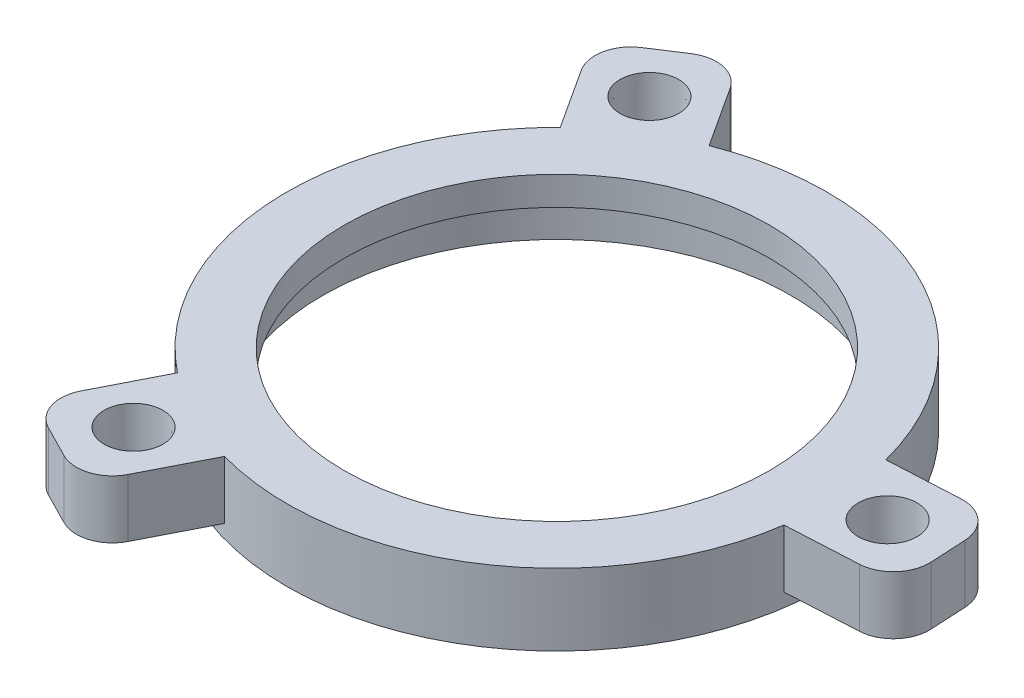
ISO-10303-21;
HEADER;
FILE_DESCRIPTION(('STEP AP214'),'2;1');
FILE_NAME('part.step','',(''),(''),'','','');
FILE_SCHEMA(('AUTOMOTIVE_DESIGN { 1 0 10303 214 1 1 1 1 }'));
ENDSEC;
DATA;
#1=APPLICATION_CONTEXT('core data for automotive mechanical design processes');
#2=APPLICATION_PROTOCOL_DEFINITION('international standard','automotive_design',2000,#1);
#3=PRODUCT_CONTEXT('',#1,'mechanical');
#4=PRODUCT('Part','Part','',(#3));
#5=PRODUCT_RELATED_PRODUCT_CATEGORY('part','',(#4));
#6=PRODUCT_DEFINITION_FORMATION('','',#4);
#7=PRODUCT_DEFINITION_CONTEXT('part definition',#1,'design');
#8=PRODUCT_DEFINITION('design','',#6,#7);
#9=PRODUCT_DEFINITION_SHAPE('','',#8);
#10=(LENGTH_UNIT() NAMED_UNIT(*) SI_UNIT(.MILLI.,.METRE.));
#11=(NAMED_UNIT(*) PLANE_ANGLE_UNIT() SI_UNIT($,.RADIAN.));
#12=(NAMED_UNIT(*) SI_UNIT($,.STERADIAN.) SOLID_ANGLE_UNIT());
#13=UNCERTAINTY_MEASURE_WITH_UNIT(LENGTH_MEASURE(1.E-05),#10,'distance_accuracy_value','');
#14=(GEOMETRIC_REPRESENTATION_CONTEXT(3) GLOBAL_UNCERTAINTY_ASSIGNED_CONTEXT((#13)) GLOBAL_UNIT_ASSIGNED_CONTEXT((#10,
#11,#12)) REPRESENTATION_CONTEXT('',''));
#15=CARTESIAN_POINT('',(0.,0.,0.));
#16=DIRECTION('',(0.,0.,1.));
#17=DIRECTION('',(1.,0.,0.));
#18=AXIS2_PLACEMENT_3D('',#15,#16,#17);
#19=CARTESIAN_POINT('',(0.,10.,0.));
#20=DIRECTION('',(0.,-1.,0.));
#21=DIRECTION('',(0.,0.,-1.));
#22=AXIS2_PLACEMENT_3D('',#19,#20,#21);
#23=PLANE('',#22);
#24=CARTESIAN_POINT('',(-19.9231223774668,10.,39.1013292804801));
#25=DIRECTION('',(0.,1.,0.));
#26=DIRECTION('',(-0.866025403784436,0.,-0.500000000000004));
#27=AXIS2_PLACEMENT_3D('',#24,#25,#26);
#28=CIRCLE('',#27,4.1);
#29=CARTESIAN_POINT('',(-23.473826532983,10.,37.0513292804801));
#30=VERTEX_POINT('',#29);
#31=EDGE_CURVE('E330',#30,#30,#28,.T.);
#32=ORIENTED_EDGE('',*,*,#31,.F.);
#33=EDGE_LOOP('',(#32));
#34=FACE_BOUND('',#33,.T.);
#35=CARTESIAN_POINT('',(-23.9011832899025,10.,-36.8045947418326));
#36=DIRECTION('',(0.,1.,0.));
#37=DIRECTION('',(0.866025403784443,0.,-0.499999999999992));
#38=AXIS2_PLACEMENT_3D('',#35,#36,#37);
#39=CIRCLE('',#38,4.1);
#40=CARTESIAN_POINT('',(-20.3504791343863,10.,-38.8545947418326));
#41=VERTEX_POINT('',#40);
#42=EDGE_CURVE('E196',#41,#41,#39,.T.);
#43=ORIENTED_EDGE('',*,*,#42,.F.);
#44=EDGE_LOOP('',(#43));
#45=FACE_BOUND('',#44,.T.);
#46=CARTESIAN_POINT('',(43.8243056673695,10.,-2.29673453864775));
#47=DIRECTION('',(0.,1.,0.));
#48=DIRECTION('',(0.,0.,1.));
#49=AXIS2_PLACEMENT_3D('',#46,#47,#48);
#50=CIRCLE('',#49,4.1);
#51=CARTESIAN_POINT('',(43.8243056673695,10.,1.80326546135225));
#52=VERTEX_POINT('',#51);
#53=EDGE_CURVE('E228',#52,#52,#50,.T.);
#54=ORIENTED_EDGE('',*,*,#53,.F.);
#55=EDGE_LOOP('',(#54));
#56=FACE_BOUND('',#55,.T.);
#57=DIRECTION('',(-0.544639035015014,0.,-0.838670567945433));
#58=VECTOR('',#57,1.);
#59=CARTESIAN_POINT('',(-13.8046602508068,10.,-35.0279010984072));
#60=LINE('',#59,#58);
#61=CARTESIAN_POINT('',(-13.8046602508068,10.,-35.0279010984072));
#62=VERTEX_POINT('',#61);
#63=CARTESIAN_POINT('',(-19.2510506009569,10.,-43.4146067778615));
#64=VERTEX_POINT('',#63);
#65=EDGE_CURVE('E172',#62,#64,#60,.T.);
#66=ORIENTED_EDGE('',*,*,#65,.T.);
#67=CARTESIAN_POINT('',(-23.4444034406841,10.,-40.6914116027864));
#68=DIRECTION('',(0.,-1.,0.));
#69=DIRECTION('',(0.,0.,-1.));
#70=AXIS2_PLACEMENT_3D('',#67,#68,#69);
#71=CIRCLE('',#70,5.);
#72=CARTESIAN_POINT('',(-26.1675986157591,10.,-44.8847644425136));
#73=VERTEX_POINT('',#72);
#74=EDGE_CURVE('E320',#64,#73,#71,.F.);
#75=ORIENTED_EDGE('',*,*,#74,.T.);
#76=DIRECTION('',(-0.838670567945432,0.,0.544639035015015));
#77=VECTOR('',#76,1.);
#78=CARTESIAN_POINT('',(-34.5543042952134,10.,-39.4383740923635));
#79=LINE('',#78,#77);
#80=CARTESIAN_POINT('',(-30.3609514554863,10.,-42.1615692674385));
#81=VERTEX_POINT('',#80);
#82=EDGE_CURVE('E193',#73,#81,#79,.T.);
#83=ORIENTED_EDGE('',*,*,#82,.T.);
#84=CARTESIAN_POINT('',(-27.6377562804112,10.,-37.9682164277114));
#85=DIRECTION('',(0.,-1.,0.));
#86=DIRECTION('',(0.,0.,-1.));
#87=AXIS2_PLACEMENT_3D('',#84,#85,#86);
#88=CIRCLE('',#87,5.);
#89=CARTESIAN_POINT('',(-31.8311091201384,10.,-35.2450212526363));
#90=VERTEX_POINT('',#89);
#91=EDGE_CURVE('E318',#81,#90,#88,.F.);
#92=ORIENTED_EDGE('',*,*,#91,.T.);
#93=DIRECTION('',(0.544639035015014,0.,0.838670567945432));
#94=VECTOR('',#93,1.);
#95=CARTESIAN_POINT('',(-26.3847187699882,10.,-26.858315573182));
#96=LINE('',#95,#94);
#97=CARTESIAN_POINT('',(-26.3847187699882,10.,-26.858315573182));
#98=VERTEX_POINT('',#97);
#99=EDGE_CURVE('E191',#90,#98,#96,.T.);
#100=ORIENTED_EDGE('',*,*,#99,.T.);
#101=CARTESIAN_POINT('',(0.,10.,0.));
#102=DIRECTION('',(0.,1.,0.));
#103=DIRECTION('',(0.,0.,1.));
#104=AXIS2_PLACEMENT_3D('',#101,#102,#103);
#105=CIRCLE('',#104,37.65);
#106=CARTESIAN_POINT('',(-23.4327220670659,10.,29.4691370170156));
#107=VERTEX_POINT('',#106);
#108=EDGE_CURVE('E275',#98,#107,#105,.T.);
#109=ORIENTED_EDGE('',*,*,#108,.T.);
#110=DIRECTION('',(-0.453990499739557,0.,0.891006524188363));
#111=VECTOR('',#110,1.);
#112=CARTESIAN_POINT('',(-23.4327220670659,10.,29.4691370170156));
#113=LINE('',#112,#111);
#114=CARTESIAN_POINT('',(-27.9726270644615,10.,38.3792022588992));
#115=VERTEX_POINT('',#114);
#116=EDGE_CURVE('E204',#107,#115,#113,.T.);
#117=ORIENTED_EDGE('',*,*,#116,.T.);
#118=CARTESIAN_POINT('',(-23.5175944435197,10.,40.649154757597));
#119=DIRECTION('',(0.,-1.,0.));
#120=DIRECTION('',(0.,0.,-1.));
#121=AXIS2_PLACEMENT_3D('',#118,#119,#120);
#122=CIRCLE('',#121,5.);
#123=CARTESIAN_POINT('',(-25.7875469422175,10.,45.1041873785388));
#124=VERTEX_POINT('',#123);
#125=EDGE_CURVE('E303',#115,#124,#122,.F.);
#126=ORIENTED_EDGE('',*,*,#125,.T.);
#127=DIRECTION('',(0.891006524188364,0.,0.453990499739556));
#128=VECTOR('',#127,1.);
#129=CARTESIAN_POINT('',(-16.8774817003339,10.,49.6440923759344));
#130=LINE('',#129,#128);
#131=CARTESIAN_POINT('',(-21.3325143212757,10.,47.3741398772366));
#132=VERTEX_POINT('',#131);
#133=EDGE_CURVE('E221',#124,#132,#130,.T.);
#134=ORIENTED_EDGE('',*,*,#133,.T.);
#135=CARTESIAN_POINT('',(-19.0625618225779,10.,42.9191072562948));
#136=DIRECTION('',(0.,-1.,0.));
#137=DIRECTION('',(0.,0.,-1.));
#138=AXIS2_PLACEMENT_3D('',#135,#136,#137);
#139=CIRCLE('',#138,5.);
#140=CARTESIAN_POINT('',(-14.6075292016361,10.,45.1890597549926));
#141=VERTEX_POINT('',#140);
#142=EDGE_CURVE('E301',#132,#141,#139,.F.);
#143=ORIENTED_EDGE('',*,*,#142,.T.);
#144=DIRECTION('',(0.453990499739557,0.,-0.891006524188363));
#145=VECTOR('',#144,1.);
#146=CARTESIAN_POINT('',(-10.0676242042405,10.,36.278994513109));
#147=LINE('',#146,#145);
#148=CARTESIAN_POINT('',(-10.0676242042405,10.,36.278994513109));
#149=VERTEX_POINT('',#148);
#150=EDGE_CURVE('E210',#141,#149,#147,.T.);
#151=ORIENTED_EDGE('',*,*,#150,.T.);
#152=CARTESIAN_POINT('',(37.2373823178729,10.,5.55876408139134));
#153=VERTEX_POINT('',#152);
#154=EDGE_CURVE('E276',#149,#153,#105,.T.);
#155=ORIENTED_EDGE('',*,*,#154,.T.);
#156=DIRECTION('',(0.998629534754574,0.,-0.0523359562429371));
#157=VECTOR('',#156,1.);
#158=CARTESIAN_POINT('',(37.2373823178729,10.,5.55876408139134));
#159=LINE('',#158,#157);
#160=CARTESIAN_POINT('',(47.2236776654186,10.,5.03540451896196));
#161=VERTEX_POINT('',#160);
#162=EDGE_CURVE('E247',#153,#161,#159,.T.);
#163=ORIENTED_EDGE('',*,*,#162,.T.);
#164=CARTESIAN_POINT('',(46.9619978842039,10.,0.0422568451890935));
#165=DIRECTION('',(0.,-1.,0.));
#166=DIRECTION('',(0.,0.,-1.));
#167=AXIS2_PLACEMENT_3D('',#164,#165,#166);
#168=CIRCLE('',#167,5.);
#169=CARTESIAN_POINT('',(51.9551455579768,10.,-0.219422936025599));
#170=VERTEX_POINT('',#169);
#171=EDGE_CURVE('E283',#161,#170,#168,.F.);
#172=ORIENTED_EDGE('',*,*,#171,.T.);
#173=DIRECTION('',(-0.0523359562429387,0.,-0.998629534754574));
#174=VECTOR('',#173,1.);
#175=CARTESIAN_POINT('',(51.4317859955474,10.,-10.2057182835713));
#176=LINE('',#175,#174);
#177=CARTESIAN_POINT('',(51.6934657767621,10.,-5.21257060979846));
#178=VERTEX_POINT('',#177);
#179=EDGE_CURVE('E250',#170,#178,#176,.T.);
#180=ORIENTED_EDGE('',*,*,#179,.T.);
#181=CARTESIAN_POINT('',(46.7003181029892,10.,-4.95089082858377));
#182=DIRECTION('',(0.,-1.,0.));
#183=DIRECTION('',(0.,0.,-1.));
#184=AXIS2_PLACEMENT_3D('',#181,#182,#183);
#185=CIRCLE('',#184,5.);
#186=CARTESIAN_POINT('',(46.4386383217746,10.,-9.94403850235664));
#187=VERTEX_POINT('',#186);
#188=EDGE_CURVE('E281',#178,#187,#185,.F.);
#189=ORIENTED_EDGE('',*,*,#188,.T.);
#190=DIRECTION('',(-0.998629534754574,0.,0.0523359562429376));
#191=VECTOR('',#190,1.);
#192=CARTESIAN_POINT('',(36.4523429742288,10.,-9.42067893992727));
#193=LINE('',#192,#191);
#194=CARTESIAN_POINT('',(36.4523429742288,10.,-9.42067893992727));
#195=VERTEX_POINT('',#194);
#196=EDGE_CURVE('E238',#187,#195,#193,.T.);
#197=ORIENTED_EDGE('',*,*,#196,.T.);
#198=EDGE_CURVE('E272',#195,#62,#105,.T.);
#199=ORIENTED_EDGE('',*,*,#198,.T.);
#200=EDGE_LOOP('',(#66,#75,#83,#92,#100,#109,#117,#126,#134,#143,#151,#155,#163,#172,#180,#189,
#197,#199));
#201=FACE_BOUND('',#200,.T.);
#202=CARTESIAN_POINT('',(0.,10.,0.));
#203=DIRECTION('',(0.,1.,0.));
#204=DIRECTION('',(0.,0.,1.));
#205=AXIS2_PLACEMENT_3D('',#202,#203,#204);
#206=CIRCLE('',#205,29.65);
#207=CARTESIAN_POINT('',(0.,10.,29.65));
#208=VERTEX_POINT('',#207);
#209=EDGE_CURVE('E257',#208,#208,#206,.T.);
#210=ORIENTED_EDGE('',*,*,#209,.F.);
#211=EDGE_LOOP('',(#210));
#212=FACE_BOUND('',#211,.T.);
#213=ADVANCED_FACE('F38',(#34,#45,#56,#201,#212),#23,.F.);
#214=CARTESIAN_POINT('',(0.,10.,0.));
#215=DIRECTION('',(0.,-1.,0.));
#216=DIRECTION('',(0.,0.,-1.));
#217=AXIS2_PLACEMENT_3D('',#214,#215,#216);
#218=CYLINDRICAL_SURFACE('',#217,32.65);
#219=CARTESIAN_POINT('',(0.,0.,0.));
#220=DIRECTION('',(0.,1.,0.));
#221=DIRECTION('',(0.,0.,1.));
#222=AXIS2_PLACEMENT_3D('',#219,#220,#221);
#223=CIRCLE('',#222,32.65);
#224=CARTESIAN_POINT('',(0.,0.,32.65));
#225=VERTEX_POINT('',#224);
#226=EDGE_CURVE('E268',#225,#225,#223,.T.);
#227=ORIENTED_EDGE('',*,*,#226,.F.);
#228=EDGE_LOOP('',(#227));
#229=FACE_BOUND('',#228,.T.);
#230=CARTESIAN_POINT('',(0.,6.,0.));
#231=DIRECTION('',(0.,1.,0.));
#232=DIRECTION('',(0.,0.,1.));
#233=AXIS2_PLACEMENT_3D('',#230,#231,#232);
#234=CIRCLE('',#233,32.65);
#235=CARTESIAN_POINT('',(0.,6.,32.65));
#236=VERTEX_POINT('',#235);
#237=EDGE_CURVE('E263',#236,#236,#234,.T.);
#238=ORIENTED_EDGE('',*,*,#237,.T.);
#239=EDGE_LOOP('',(#238));
#240=FACE_BOUND('',#239,.T.);
#241=ADVANCED_FACE('F345',(#229,#240),#218,.F.);
#242=CARTESIAN_POINT('',(0.,0.,0.));
#243=DIRECTION('',(0.,1.,0.));
#244=DIRECTION('',(0.,0.,1.));
#245=AXIS2_PLACEMENT_3D('',#242,#243,#244);
#246=PLANE('',#245);
#247=CARTESIAN_POINT('',(0.,0.,0.));
#248=DIRECTION('',(0.,1.,0.));
#249=DIRECTION('',(0.,0.,1.));
#250=AXIS2_PLACEMENT_3D('',#247,#248,#249);
#251=CIRCLE('',#250,37.65);
#252=CARTESIAN_POINT('',(0.,0.,37.65));
#253=VERTEX_POINT('',#252);
#254=EDGE_CURVE('E271',#253,#253,#251,.T.);
#255=ORIENTED_EDGE('',*,*,#254,.F.);
#256=EDGE_LOOP('',(#255));
#257=FACE_BOUND('',#256,.T.);
#258=ORIENTED_EDGE('',*,*,#226,.T.);
#259=EDGE_LOOP('',(#258));
#260=FACE_BOUND('',#259,.T.);
#261=ADVANCED_FACE('F375',(#257,#260),#246,.F.);
#262=CARTESIAN_POINT('',(0.,10.,0.));
#263=DIRECTION('',(0.,-1.,0.));
#264=DIRECTION('',(0.,0.,-1.));
#265=AXIS2_PLACEMENT_3D('',#262,#263,#264);
#266=CYLINDRICAL_SURFACE('',#265,37.65);
#267=ORIENTED_EDGE('',*,*,#108,.F.);
#268=DIRECTION('',(0.,1.,0.));
#269=VECTOR('',#268,1.);
#270=CARTESIAN_POINT('',(-26.3847187699882,1.9,-26.858315573182));
#271=LINE('',#270,#269);
#272=CARTESIAN_POINT('',(-26.3847187699882,1.9,-26.858315573182));
#273=VERTEX_POINT('',#272);
#274=EDGE_CURVE('E177',#273,#98,#271,.T.);
#275=ORIENTED_EDGE('',*,*,#274,.F.);
#276=CARTESIAN_POINT('',(0.,1.9,0.));
#277=DIRECTION('',(0.,-1.,0.));
#278=DIRECTION('',(0.866025403784443,0.,-0.499999999999992));
#279=AXIS2_PLACEMENT_3D('',#276,#277,#278);
#280=CIRCLE('',#279,37.65);
#281=CARTESIAN_POINT('',(-13.8046602508068,1.9,-35.0279010984072));
#282=VERTEX_POINT('',#281);
#283=EDGE_CURVE('E182',#273,#282,#280,.T.);
#284=ORIENTED_EDGE('',*,*,#283,.T.);
#285=DIRECTION('',(0.,1.,0.));
#286=VECTOR('',#285,1.);
#287=CARTESIAN_POINT('',(-13.8046602508068,1.9,-35.0279010984072));
#288=LINE('',#287,#286);
#289=EDGE_CURVE('E165',#282,#62,#288,.T.);
#290=ORIENTED_EDGE('',*,*,#289,.T.);
#291=ORIENTED_EDGE('',*,*,#198,.F.);
#292=DIRECTION('',(0.,1.,0.));
#293=VECTOR('',#292,1.);
#294=CARTESIAN_POINT('',(36.4523429742288,1.9,-9.42067893992727));
#295=LINE('',#294,#293);
#296=CARTESIAN_POINT('',(36.4523429742288,1.9,-9.42067893992727));
#297=VERTEX_POINT('',#296);
#298=EDGE_CURVE('E254',#297,#195,#295,.T.);
#299=ORIENTED_EDGE('',*,*,#298,.F.);
#300=CARTESIAN_POINT('',(0.,1.9,0.));
#301=DIRECTION('',(0.,-1.,0.));
#302=DIRECTION('',(0.,0.,1.));
#303=AXIS2_PLACEMENT_3D('',#300,#301,#302);
#304=CIRCLE('',#303,37.65);
#305=CARTESIAN_POINT('',(37.2373823178729,1.9,5.55876408139134));
#306=VERTEX_POINT('',#305);
#307=EDGE_CURVE('E234',#297,#306,#304,.T.);
#308=ORIENTED_EDGE('',*,*,#307,.T.);
#309=DIRECTION('',(0.,1.,0.));
#310=VECTOR('',#309,1.);
#311=CARTESIAN_POINT('',(37.2373823178729,1.9,5.55876408139134));
#312=LINE('',#311,#310);
#313=EDGE_CURVE('E246',#306,#153,#312,.T.);
#314=ORIENTED_EDGE('',*,*,#313,.T.);
#315=ORIENTED_EDGE('',*,*,#154,.F.);
#316=DIRECTION('',(0.,1.,0.));
#317=VECTOR('',#316,1.);
#318=CARTESIAN_POINT('',(-10.0676242042405,1.9,36.278994513109));
#319=LINE('',#318,#317);
#320=CARTESIAN_POINT('',(-10.0676242042405,1.9,36.278994513109));
#321=VERTEX_POINT('',#320);
#322=EDGE_CURVE('E225',#321,#149,#319,.T.);
#323=ORIENTED_EDGE('',*,*,#322,.F.);
#324=CARTESIAN_POINT('',(0.,1.9,0.));
#325=DIRECTION('',(0.,-1.,0.));
#326=DIRECTION('',(-0.866025403784436,0.,-0.500000000000004));
#327=AXIS2_PLACEMENT_3D('',#324,#325,#326);
#328=CIRCLE('',#327,37.65);
#329=CARTESIAN_POINT('',(-23.4327220670659,1.9,29.4691370170156));
#330=VERTEX_POINT('',#329);
#331=EDGE_CURVE('E206',#321,#330,#328,.T.);
#332=ORIENTED_EDGE('',*,*,#331,.T.);
#333=DIRECTION('',(0.,1.,0.));
#334=VECTOR('',#333,1.);
#335=CARTESIAN_POINT('',(-23.4327220670659,1.9,29.4691370170156));
#336=LINE('',#335,#334);
#337=EDGE_CURVE('E218',#330,#107,#336,.T.);
#338=ORIENTED_EDGE('',*,*,#337,.T.);
#339=EDGE_LOOP('',(#267,#275,#284,#290,#291,#299,#308,#314,#315,#323,#332,#338));
#340=FACE_BOUND('',#339,.T.);
#341=ORIENTED_EDGE('',*,*,#254,.T.);
#342=EDGE_LOOP('',(#341));
#343=FACE_BOUND('',#342,.T.);
#344=ADVANCED_FACE('F188',(#340,#343),#266,.T.);
#345=CARTESIAN_POINT('',(0.,6.,0.));
#346=DIRECTION('',(0.,1.,0.));
#347=DIRECTION('',(0.,0.,1.));
#348=AXIS2_PLACEMENT_3D('',#345,#346,#347);
#349=PLANE('',#348);
#350=CARTESIAN_POINT('',(0.,6.,0.));
#351=DIRECTION('',(0.,1.,0.));
#352=DIRECTION('',(0.,0.,1.));
#353=AXIS2_PLACEMENT_3D('',#350,#351,#352);
#354=CIRCLE('',#353,29.65);
#355=CARTESIAN_POINT('',(0.,6.,29.65));
#356=VERTEX_POINT('',#355);
#357=EDGE_CURVE('E260',#356,#356,#354,.T.);
#358=ORIENTED_EDGE('',*,*,#357,.T.);
#359=EDGE_LOOP('',(#358));
#360=FACE_BOUND('',#359,.T.);
#361=ORIENTED_EDGE('',*,*,#237,.F.);
#362=EDGE_LOOP('',(#361));
#363=FACE_BOUND('',#362,.T.);
#364=ADVANCED_FACE('F356',(#360,#363),#349,.F.);
#365=CARTESIAN_POINT('',(0.,6.,0.));
#366=DIRECTION('',(0.,1.,0.));
#367=DIRECTION('',(0.,0.,1.));
#368=AXIS2_PLACEMENT_3D('',#365,#366,#367);
#369=CYLINDRICAL_SURFACE('',#368,29.65);
#370=ORIENTED_EDGE('',*,*,#357,.F.);
#371=EDGE_LOOP('',(#370));
#372=FACE_BOUND('',#371,.T.);
#373=ORIENTED_EDGE('',*,*,#209,.T.);
#374=EDGE_LOOP('',(#373));
#375=FACE_BOUND('',#374,.T.);
#376=ADVANCED_FACE('F348',(#372,#375),#369,.F.);
#377=CARTESIAN_POINT('',(36.4523429742288,1.9,-9.42067893992727));
#378=DIRECTION('',(-0.0523359562429376,0.,-0.998629534754574));
#379=DIRECTION('',(-0.998629534754574,0.,0.0523359562429376));
#380=AXIS2_PLACEMENT_3D('',#377,#378,#379);
#381=PLANE('',#380);
#382=ORIENTED_EDGE('',*,*,#196,.F.);
#383=DIRECTION('',(0.,1.,0.));
#384=VECTOR('',#383,1.);
#385=CARTESIAN_POINT('',(46.4386383217746,1.9,-9.94403850235664));
#386=LINE('',#385,#384);
#387=CARTESIAN_POINT('',(46.4386383217746,1.9,-9.94403850235664));
#388=VERTEX_POINT('',#387);
#389=EDGE_CURVE('E294',#187,#388,#386,.F.);
#390=ORIENTED_EDGE('',*,*,#389,.T.);
#391=DIRECTION('',(-0.998629534754574,0.,0.0523359562429376));
#392=VECTOR('',#391,1.);
#393=CARTESIAN_POINT('',(36.4523429742288,1.9,-9.42067893992727));
#394=LINE('',#393,#392);
#395=EDGE_CURVE('E244',#388,#297,#394,.T.);
#396=ORIENTED_EDGE('',*,*,#395,.T.);
#397=ORIENTED_EDGE('',*,*,#298,.T.);
#398=EDGE_LOOP('',(#382,#390,#396,#397));
#399=FACE_BOUND('',#398,.T.);
#400=ADVANCED_FACE('F355',(#399),#381,.T.);
#401=CARTESIAN_POINT('',(51.4317859955474,1.9,-10.2057182835713));
#402=DIRECTION('',(0.998629534754574,0.,-0.0523359562429387));
#403=DIRECTION('',(-0.0523359562429387,0.,-0.998629534754574));
#404=AXIS2_PLACEMENT_3D('',#401,#402,#403);
#405=PLANE('',#404);
#406=ORIENTED_EDGE('',*,*,#179,.F.);
#407=DIRECTION('',(0.,1.,0.));
#408=VECTOR('',#407,1.);
#409=CARTESIAN_POINT('',(51.9551455579768,1.9,-0.219422936025598));
#410=LINE('',#409,#408);
#411=CARTESIAN_POINT('',(51.9551455579768,1.9,-0.219422936025599));
#412=VERTEX_POINT('',#411);
#413=EDGE_CURVE('E288',#170,#412,#410,.F.);
#414=ORIENTED_EDGE('',*,*,#413,.T.);
#415=DIRECTION('',(-0.0523359562429387,0.,-0.998629534754574));
#416=VECTOR('',#415,1.);
#417=CARTESIAN_POINT('',(51.4317859955474,1.9,-10.2057182835713));
#418=LINE('',#417,#416);
#419=CARTESIAN_POINT('',(51.6934657767621,1.9,-5.21257060979846));
#420=VERTEX_POINT('',#419);
#421=EDGE_CURVE('E241',#412,#420,#418,.T.);
#422=ORIENTED_EDGE('',*,*,#421,.T.);
#423=DIRECTION('',(0.,1.,0.));
#424=VECTOR('',#423,1.);
#425=CARTESIAN_POINT('',(51.6934657767621,1.9,-5.21257060979846));
#426=LINE('',#425,#424);
#427=EDGE_CURVE('E285',#420,#178,#426,.T.);
#428=ORIENTED_EDGE('',*,*,#427,.T.);
#429=EDGE_LOOP('',(#406,#414,#422,#428));
#430=FACE_BOUND('',#429,.T.);
#431=ADVANCED_FACE('F363',(#430),#405,.T.);
#432=CARTESIAN_POINT('',(37.2373823178729,1.9,5.55876408139134));
#433=DIRECTION('',(0.0523359562429371,0.,0.998629534754574));
#434=DIRECTION('',(0.998629534754574,0.,-0.0523359562429371));
#435=AXIS2_PLACEMENT_3D('',#432,#433,#434);
#436=PLANE('',#435);
#437=DIRECTION('',(0.998629534754574,0.,-0.0523359562429371));
#438=VECTOR('',#437,1.);
#439=CARTESIAN_POINT('',(37.2373823178729,1.9,5.55876408139134));
#440=LINE('',#439,#438);
#441=CARTESIAN_POINT('',(47.2236776654186,1.9,5.03540451896196));
#442=VERTEX_POINT('',#441);
#443=EDGE_CURVE('E237',#306,#442,#440,.T.);
#444=ORIENTED_EDGE('',*,*,#443,.T.);
#445=DIRECTION('',(0.,1.,0.));
#446=VECTOR('',#445,1.);
#447=CARTESIAN_POINT('',(47.2236776654186,1.9,5.03540451896196));
#448=LINE('',#447,#446);
#449=EDGE_CURVE('E274',#442,#161,#448,.T.);
#450=ORIENTED_EDGE('',*,*,#449,.T.);
#451=ORIENTED_EDGE('',*,*,#162,.F.);
#452=ORIENTED_EDGE('',*,*,#313,.F.);
#453=EDGE_LOOP('',(#444,#450,#451,#452));
#454=FACE_BOUND('',#453,.T.);
#455=ADVANCED_FACE('F370',(#454),#436,.T.);
#456=CARTESIAN_POINT('',(0.,1.9,0.));
#457=DIRECTION('',(0.,1.,0.));
#458=DIRECTION('',(0.,0.,1.));
#459=AXIS2_PLACEMENT_3D('',#456,#457,#458);
#460=PLANE('',#459);
#461=CARTESIAN_POINT('',(43.8243056673695,1.9,-2.29673453864775));
#462=DIRECTION('',(0.,1.,0.));
#463=DIRECTION('',(0.,0.,1.));
#464=AXIS2_PLACEMENT_3D('',#461,#462,#463);
#465=CIRCLE('',#464,3.81714176711684);
#466=CARTESIAN_POINT('',(43.8243056673695,1.9,1.52040722846909));
#467=VERTEX_POINT('',#466);
#468=EDGE_CURVE('E233',#467,#467,#465,.T.);
#469=ORIENTED_EDGE('',*,*,#468,.T.);
#470=EDGE_LOOP('',(#469));
#471=FACE_BOUND('',#470,.T.);
#472=ORIENTED_EDGE('',*,*,#421,.F.);
#473=CARTESIAN_POINT('',(46.9619978842039,1.9,0.0422568451890935));
#474=DIRECTION('',(0.,1.,0.));
#475=DIRECTION('',(0.,0.,1.));
#476=AXIS2_PLACEMENT_3D('',#473,#474,#475);
#477=CIRCLE('',#476,5.);
#478=EDGE_CURVE('E292',#412,#442,#477,.F.);
#479=ORIENTED_EDGE('',*,*,#478,.T.);
#480=ORIENTED_EDGE('',*,*,#443,.F.);
#481=ORIENTED_EDGE('',*,*,#307,.F.);
#482=ORIENTED_EDGE('',*,*,#395,.F.);
#483=CARTESIAN_POINT('',(46.7003181029892,1.9,-4.95089082858377));
#484=DIRECTION('',(0.,1.,0.));
#485=DIRECTION('',(0.,0.,1.));
#486=AXIS2_PLACEMENT_3D('',#483,#484,#485);
#487=CIRCLE('',#486,5.);
#488=EDGE_CURVE('E290',#388,#420,#487,.F.);
#489=ORIENTED_EDGE('',*,*,#488,.T.);
#490=EDGE_LOOP('',(#472,#479,#480,#481,#482,#489));
#491=FACE_BOUND('',#490,.T.);
#492=ADVANCED_FACE('F386',(#471,#491),#460,.F.);
#493=CARTESIAN_POINT('',(46.9619978842039,1.9,0.0422568451890935));
#494=DIRECTION('',(0.,1.,0.));
#495=DIRECTION('',(0.,0.,1.));
#496=AXIS2_PLACEMENT_3D('',#493,#494,#495);
#497=CYLINDRICAL_SURFACE('',#496,5.);
#498=ORIENTED_EDGE('',*,*,#478,.F.);
#499=ORIENTED_EDGE('',*,*,#413,.F.);
#500=ORIENTED_EDGE('',*,*,#171,.F.);
#501=ORIENTED_EDGE('',*,*,#449,.F.);
#502=EDGE_LOOP('',(#498,#499,#500,#501));
#503=FACE_BOUND('',#502,.T.);
#504=ADVANCED_FACE('F382',(#503),#497,.T.);
#505=CARTESIAN_POINT('',(46.7003181029892,1.9,-4.95089082858377));
#506=DIRECTION('',(0.,1.,0.));
#507=DIRECTION('',(0.,0.,1.));
#508=AXIS2_PLACEMENT_3D('',#505,#506,#507);
#509=CYLINDRICAL_SURFACE('',#508,5.);
#510=ORIENTED_EDGE('',*,*,#488,.F.);
#511=ORIENTED_EDGE('',*,*,#389,.F.);
#512=ORIENTED_EDGE('',*,*,#188,.F.);
#513=ORIENTED_EDGE('',*,*,#427,.F.);
#514=EDGE_LOOP('',(#510,#511,#512,#513));
#515=FACE_BOUND('',#514,.T.);
#516=ADVANCED_FACE('F385',(#515),#509,.T.);
#517=CARTESIAN_POINT('',(43.8243056673695,10.,-2.29673453864775));
#518=DIRECTION('',(0.,1.,0.));
#519=DIRECTION('',(0.,0.,1.));
#520=AXIS2_PLACEMENT_3D('',#517,#518,#519);
#521=CONICAL_SURFACE('',#520,4.1,0.0349065850398867);
#522=ORIENTED_EDGE('',*,*,#53,.T.);
#523=EDGE_LOOP('',(#522));
#524=FACE_BOUND('',#523,.T.);
#525=ORIENTED_EDGE('',*,*,#468,.F.);
#526=EDGE_LOOP('',(#525));
#527=FACE_BOUND('',#526,.T.);
#528=ADVANCED_FACE('F390',(#524,#527),#521,.F.);
#529=CARTESIAN_POINT('',(-10.0676242042405,1.9,36.278994513109));
#530=DIRECTION('',(0.891006524188363,0.,0.453990499739556));
#531=DIRECTION('',(0.453990499739557,0.,-0.891006524188363));
#532=AXIS2_PLACEMENT_3D('',#529,#530,#531);
#533=PLANE('',#532);
#534=ORIENTED_EDGE('',*,*,#150,.F.);
#535=DIRECTION('',(0.,1.,0.));
#536=VECTOR('',#535,1.);
#537=CARTESIAN_POINT('',(-14.6075292016361,1.9,45.1890597549926));
#538=LINE('',#537,#536);
#539=CARTESIAN_POINT('',(-14.6075292016361,1.9,45.1890597549926));
#540=VERTEX_POINT('',#539);
#541=EDGE_CURVE('E314',#141,#540,#538,.F.);
#542=ORIENTED_EDGE('',*,*,#541,.T.);
#543=DIRECTION('',(0.453990499739557,0.,-0.891006524188363));
#544=VECTOR('',#543,1.);
#545=CARTESIAN_POINT('',(-10.0676242042405,1.9,36.278994513109));
#546=LINE('',#545,#544);
#547=EDGE_CURVE('E216',#540,#321,#546,.T.);
#548=ORIENTED_EDGE('',*,*,#547,.T.);
#549=ORIENTED_EDGE('',*,*,#322,.T.);
#550=EDGE_LOOP('',(#534,#542,#548,#549));
#551=FACE_BOUND('',#550,.T.);
#552=ADVANCED_FACE('F443',(#551),#533,.T.);
#553=CARTESIAN_POINT('',(-16.8774817003339,1.9,49.6440923759344));
#554=DIRECTION('',(-0.453990499739556,0.,0.891006524188363));
#555=DIRECTION('',(0.891006524188364,0.,0.453990499739556));
#556=AXIS2_PLACEMENT_3D('',#553,#554,#555);
#557=PLANE('',#556);
#558=ORIENTED_EDGE('',*,*,#133,.F.);
#559=DIRECTION('',(0.,1.,0.));
#560=VECTOR('',#559,1.);
#561=CARTESIAN_POINT('',(-25.7875469422175,1.9,45.1041873785388));
#562=LINE('',#561,#560);
#563=CARTESIAN_POINT('',(-25.7875469422175,1.9,45.1041873785388));
#564=VERTEX_POINT('',#563);
#565=EDGE_CURVE('E308',#124,#564,#562,.F.);
#566=ORIENTED_EDGE('',*,*,#565,.T.);
#567=DIRECTION('',(0.891006524188364,0.,0.453990499739556));
#568=VECTOR('',#567,1.);
#569=CARTESIAN_POINT('',(-16.8774817003339,1.9,49.6440923759344));
#570=LINE('',#569,#568);
#571=CARTESIAN_POINT('',(-21.3325143212757,1.9,47.3741398772366));
#572=VERTEX_POINT('',#571);
#573=EDGE_CURVE('E213',#564,#572,#570,.T.);
#574=ORIENTED_EDGE('',*,*,#573,.T.);
#575=DIRECTION('',(0.,1.,0.));
#576=VECTOR('',#575,1.);
#577=CARTESIAN_POINT('',(-21.3325143212757,1.9,47.3741398772366));
#578=LINE('',#577,#576);
#579=EDGE_CURVE('E305',#572,#132,#578,.T.);
#580=ORIENTED_EDGE('',*,*,#579,.T.);
#581=EDGE_LOOP('',(#558,#566,#574,#580));
#582=FACE_BOUND('',#581,.T.);
#583=ADVANCED_FACE('F449',(#582),#557,.T.);
#584=CARTESIAN_POINT('',(-23.4327220670659,1.9,29.4691370170156));
#585=DIRECTION('',(-0.891006524188363,0.,-0.453990499739557));
#586=DIRECTION('',(-0.453990499739557,0.,0.891006524188363));
#587=AXIS2_PLACEMENT_3D('',#584,#585,#586);
#588=PLANE('',#587);
#589=DIRECTION('',(-0.453990499739557,0.,0.891006524188363));
#590=VECTOR('',#589,1.);
#591=CARTESIAN_POINT('',(-23.4327220670659,1.9,29.4691370170156));
#592=LINE('',#591,#590);
#593=CARTESIAN_POINT('',(-27.9726270644615,1.9,38.3792022588992));
#594=VERTEX_POINT('',#593);
#595=EDGE_CURVE('E209',#330,#594,#592,.T.);
#596=ORIENTED_EDGE('',*,*,#595,.T.);
#597=DIRECTION('',(0.,1.,0.));
#598=VECTOR('',#597,1.);
#599=CARTESIAN_POINT('',(-27.9726270644615,1.9,38.3792022588992));
#600=LINE('',#599,#598);
#601=EDGE_CURVE('E296',#594,#115,#600,.T.);
#602=ORIENTED_EDGE('',*,*,#601,.T.);
#603=ORIENTED_EDGE('',*,*,#116,.F.);
#604=ORIENTED_EDGE('',*,*,#337,.F.);
#605=EDGE_LOOP('',(#596,#602,#603,#604));
#606=FACE_BOUND('',#605,.T.);
#607=ADVANCED_FACE('F445',(#606),#588,.T.);
#608=CARTESIAN_POINT('',(0.,1.9,0.));
#609=DIRECTION('',(0.,1.,0.));
#610=DIRECTION('',(-0.866025403784436,0.,-0.500000000000004));
#611=AXIS2_PLACEMENT_3D('',#608,#609,#610);
#612=PLANE('',#611);
#613=CARTESIAN_POINT('',(-19.9231223774668,1.9,39.1013292804801));
#614=DIRECTION('',(0.,1.,0.));
#615=DIRECTION('',(0.,0.,1.));
#616=AXIS2_PLACEMENT_3D('',#613,#614,#615);
#617=CIRCLE('',#616,3.81714176711684);
#618=CARTESIAN_POINT('',(-19.9231223774668,1.9,42.9184710475969));
#619=VERTEX_POINT('',#618);
#620=EDGE_CURVE('E42',#619,#619,#617,.T.);
#621=ORIENTED_EDGE('',*,*,#620,.T.);
#622=EDGE_LOOP('',(#621));
#623=FACE_BOUND('',#622,.T.);
#624=ORIENTED_EDGE('',*,*,#573,.F.);
#625=CARTESIAN_POINT('',(-23.5175944435197,1.9,40.649154757597));
#626=DIRECTION('',(0.,1.,0.));
#627=DIRECTION('',(0.,0.,1.));
#628=AXIS2_PLACEMENT_3D('',#625,#626,#627);
#629=CIRCLE('',#628,5.);
#630=EDGE_CURVE('E312',#564,#594,#629,.F.);
#631=ORIENTED_EDGE('',*,*,#630,.T.);
#632=ORIENTED_EDGE('',*,*,#595,.F.);
#633=ORIENTED_EDGE('',*,*,#331,.F.);
#634=ORIENTED_EDGE('',*,*,#547,.F.);
#635=CARTESIAN_POINT('',(-19.0625618225779,1.9,42.9191072562948));
#636=DIRECTION('',(0.,1.,0.));
#637=DIRECTION('',(0.,0.,1.));
#638=AXIS2_PLACEMENT_3D('',#635,#636,#637);
#639=CIRCLE('',#638,5.);
#640=EDGE_CURVE('E310',#540,#572,#639,.F.);
#641=ORIENTED_EDGE('',*,*,#640,.T.);
#642=EDGE_LOOP('',(#624,#631,#632,#633,#634,#641));
#643=FACE_BOUND('',#642,.T.);
#644=ADVANCED_FACE('F448',(#623,#643),#612,.F.);
#645=CARTESIAN_POINT('',(-26.3847187699882,1.9,-26.858315573182));
#646=DIRECTION('',(-0.838670567945432,0.,0.544639035015014));
#647=DIRECTION('',(0.544639035015014,0.,0.838670567945432));
#648=AXIS2_PLACEMENT_3D('',#645,#646,#647);
#649=PLANE('',#648);
#650=ORIENTED_EDGE('',*,*,#99,.F.);
#651=DIRECTION('',(0.,1.,0.));
#652=VECTOR('',#651,1.);
#653=CARTESIAN_POINT('',(-31.8311091201384,1.9,-35.2450212526363));
#654=LINE('',#653,#652);
#655=CARTESIAN_POINT('',(-31.8311091201384,1.9,-35.2450212526363));
#656=VERTEX_POINT('',#655);
#657=EDGE_CURVE('E11',#90,#656,#654,.F.);
#658=ORIENTED_EDGE('',*,*,#657,.T.);
#659=DIRECTION('',(0.544639035015014,0.,0.838670567945432));
#660=VECTOR('',#659,1.);
#661=CARTESIAN_POINT('',(-26.3847187699882,1.9,-26.858315573182));
#662=LINE('',#661,#660);
#663=EDGE_CURVE('E178',#656,#273,#662,.T.);
#664=ORIENTED_EDGE('',*,*,#663,.T.);
#665=ORIENTED_EDGE('',*,*,#274,.T.);
#666=EDGE_LOOP('',(#650,#658,#664,#665));
#667=FACE_BOUND('',#666,.T.);
#668=ADVANCED_FACE('F411',(#667),#649,.T.);
#669=CARTESIAN_POINT('',(-34.5543042952134,1.9,-39.4383740923635));
#670=DIRECTION('',(-0.544639035015015,0.,-0.838670567945432));
#671=DIRECTION('',(-0.838670567945432,0.,0.544639035015015));
#672=AXIS2_PLACEMENT_3D('',#669,#670,#671);
#673=PLANE('',#672);
#674=ORIENTED_EDGE('',*,*,#82,.F.);
#675=DIRECTION('',(0.,1.,0.));
#676=VECTOR('',#675,1.);
#677=CARTESIAN_POINT('',(-26.1675986157591,1.9,-44.8847644425136));
#678=LINE('',#677,#676);
#679=CARTESIAN_POINT('',(-26.1675986157591,1.9,-44.8847644425136));
#680=VERTEX_POINT('',#679);
#681=EDGE_CURVE('E325',#73,#680,#678,.F.);
#682=ORIENTED_EDGE('',*,*,#681,.T.);
#683=DIRECTION('',(-0.838670567945432,0.,0.544639035015015));
#684=VECTOR('',#683,1.);
#685=CARTESIAN_POINT('',(-34.5543042952134,1.9,-39.4383740923635));
#686=LINE('',#685,#684);
#687=CARTESIAN_POINT('',(-30.3609514554863,1.9,-42.1615692674385));
#688=VERTEX_POINT('',#687);
#689=EDGE_CURVE('E185',#680,#688,#686,.T.);
#690=ORIENTED_EDGE('',*,*,#689,.T.);
#691=DIRECTION('',(0.,1.,0.));
#692=VECTOR('',#691,1.);
#693=CARTESIAN_POINT('',(-30.3609514554863,1.9,-42.1615692674385));
#694=LINE('',#693,#692);
#695=EDGE_CURVE('E322',#688,#81,#694,.T.);
#696=ORIENTED_EDGE('',*,*,#695,.T.);
#697=EDGE_LOOP('',(#674,#682,#690,#696));
#698=FACE_BOUND('',#697,.T.);
#699=ADVANCED_FACE('F409',(#698),#673,.T.);
#700=CARTESIAN_POINT('',(-13.8046602508068,1.9,-35.0279010984072));
#701=DIRECTION('',(0.838670567945433,0.,-0.544639035015014));
#702=DIRECTION('',(-0.544639035015014,0.,-0.838670567945433));
#703=AXIS2_PLACEMENT_3D('',#700,#701,#702);
#704=PLANE('',#703);
#705=DIRECTION('',(-0.544639035015014,0.,-0.838670567945433));
#706=VECTOR('',#705,1.);
#707=CARTESIAN_POINT('',(-13.8046602508068,1.9,-35.0279010984072));
#708=LINE('',#707,#706);
#709=CARTESIAN_POINT('',(-19.2510506009569,1.9,-43.4146067778615));
#710=VERTEX_POINT('',#709);
#711=EDGE_CURVE('E169',#282,#710,#708,.T.);
#712=ORIENTED_EDGE('',*,*,#711,.T.);
#713=DIRECTION('',(0.,1.,0.));
#714=VECTOR('',#713,1.);
#715=CARTESIAN_POINT('',(-19.2510506009569,1.9,-43.4146067778615));
#716=LINE('',#715,#714);
#717=EDGE_CURVE('E316',#710,#64,#716,.T.);
#718=ORIENTED_EDGE('',*,*,#717,.T.);
#719=ORIENTED_EDGE('',*,*,#65,.F.);
#720=ORIENTED_EDGE('',*,*,#289,.F.);
#721=EDGE_LOOP('',(#712,#718,#719,#720));
#722=FACE_BOUND('',#721,.T.);
#723=ADVANCED_FACE('F167',(#722),#704,.T.);
#724=CARTESIAN_POINT('',(0.,1.9,0.));
#725=DIRECTION('',(0.,1.,0.));
#726=DIRECTION('',(0.866025403784443,0.,-0.499999999999992));
#727=AXIS2_PLACEMENT_3D('',#724,#725,#726);
#728=PLANE('',#727);
#729=CARTESIAN_POINT('',(-23.9011832899025,1.9,-36.8045947418326));
#730=DIRECTION('',(0.,1.,0.));
#731=DIRECTION('',(0.,0.,1.));
#732=AXIS2_PLACEMENT_3D('',#729,#730,#731);
#733=CIRCLE('',#732,3.81714176711684);
#734=CARTESIAN_POINT('',(-23.9011832899025,1.9,-32.9874529747158));
#735=VERTEX_POINT('',#734);
#736=EDGE_CURVE('E328',#735,#735,#733,.T.);
#737=ORIENTED_EDGE('',*,*,#736,.T.);
#738=EDGE_LOOP('',(#737));
#739=FACE_BOUND('',#738,.T.);
#740=ORIENTED_EDGE('',*,*,#689,.F.);
#741=CARTESIAN_POINT('',(-23.4444034406841,1.9,-40.6914116027864));
#742=DIRECTION('',(0.,1.,0.));
#743=DIRECTION('',(0.,0.,1.));
#744=AXIS2_PLACEMENT_3D('',#741,#742,#743);
#745=CIRCLE('',#744,5.);
#746=EDGE_CURVE('E47',#680,#710,#745,.F.);
#747=ORIENTED_EDGE('',*,*,#746,.T.);
#748=ORIENTED_EDGE('',*,*,#711,.F.);
#749=ORIENTED_EDGE('',*,*,#283,.F.);
#750=ORIENTED_EDGE('',*,*,#663,.F.);
#751=CARTESIAN_POINT('',(-27.6377562804112,1.9,-37.9682164277114));
#752=DIRECTION('',(0.,1.,0.));
#753=DIRECTION('',(0.,0.,1.));
#754=AXIS2_PLACEMENT_3D('',#751,#752,#753);
#755=CIRCLE('',#754,5.);
#756=EDGE_CURVE('E60',#656,#688,#755,.F.);
#757=ORIENTED_EDGE('',*,*,#756,.T.);
#758=EDGE_LOOP('',(#740,#747,#748,#749,#750,#757));
#759=FACE_BOUND('',#758,.T.);
#760=ADVANCED_FACE('F181',(#739,#759),#728,.F.);
#761=CARTESIAN_POINT('',(-23.5175944435197,1.9,40.649154757597));
#762=DIRECTION('',(0.,1.,0.));
#763=DIRECTION('',(0.,0.,1.));
#764=AXIS2_PLACEMENT_3D('',#761,#762,#763);
#765=CYLINDRICAL_SURFACE('',#764,5.);
#766=ORIENTED_EDGE('',*,*,#630,.F.);
#767=ORIENTED_EDGE('',*,*,#565,.F.);
#768=ORIENTED_EDGE('',*,*,#125,.F.);
#769=ORIENTED_EDGE('',*,*,#601,.F.);
#770=EDGE_LOOP('',(#766,#767,#768,#769));
#771=FACE_BOUND('',#770,.T.);
#772=ADVANCED_FACE('F392',(#771),#765,.T.);
#773=CARTESIAN_POINT('',(-19.0625618225779,1.9,42.9191072562948));
#774=DIRECTION('',(0.,1.,0.));
#775=DIRECTION('',(0.,0.,1.));
#776=AXIS2_PLACEMENT_3D('',#773,#774,#775);
#777=CYLINDRICAL_SURFACE('',#776,5.);
#778=ORIENTED_EDGE('',*,*,#640,.F.);
#779=ORIENTED_EDGE('',*,*,#541,.F.);
#780=ORIENTED_EDGE('',*,*,#142,.F.);
#781=ORIENTED_EDGE('',*,*,#579,.F.);
#782=EDGE_LOOP('',(#778,#779,#780,#781));
#783=FACE_BOUND('',#782,.T.);
#784=ADVANCED_FACE('F395',(#783),#777,.T.);
#785=CARTESIAN_POINT('',(-23.4444034406841,1.9,-40.6914116027864));
#786=DIRECTION('',(0.,1.,0.));
#787=DIRECTION('',(0.,0.,1.));
#788=AXIS2_PLACEMENT_3D('',#785,#786,#787);
#789=CYLINDRICAL_SURFACE('',#788,5.);
#790=ORIENTED_EDGE('',*,*,#746,.F.);
#791=ORIENTED_EDGE('',*,*,#681,.F.);
#792=ORIENTED_EDGE('',*,*,#74,.F.);
#793=ORIENTED_EDGE('',*,*,#717,.F.);
#794=EDGE_LOOP('',(#790,#791,#792,#793));
#795=FACE_BOUND('',#794,.T.);
#796=ADVANCED_FACE('F398',(#795),#789,.T.);
#797=CARTESIAN_POINT('',(-27.6377562804112,1.9,-37.9682164277114));
#798=DIRECTION('',(0.,1.,0.));
#799=DIRECTION('',(0.,0.,1.));
#800=AXIS2_PLACEMENT_3D('',#797,#798,#799);
#801=CYLINDRICAL_SURFACE('',#800,5.);
#802=ORIENTED_EDGE('',*,*,#756,.F.);
#803=ORIENTED_EDGE('',*,*,#657,.F.);
#804=ORIENTED_EDGE('',*,*,#91,.F.);
#805=ORIENTED_EDGE('',*,*,#695,.F.);
#806=EDGE_LOOP('',(#802,#803,#804,#805));
#807=FACE_BOUND('',#806,.T.);
#808=ADVANCED_FACE('F40',(#807),#801,.T.);
#809=CARTESIAN_POINT('',(-23.9011832899025,10.,-36.8045947418326));
#810=DIRECTION('',(0.,1.,0.));
#811=DIRECTION('',(0.866025403784443,0.,-0.499999999999992));
#812=AXIS2_PLACEMENT_3D('',#809,#810,#811);
#813=CONICAL_SURFACE('',#812,4.1,0.0349065850398867);
#814=ORIENTED_EDGE('',*,*,#42,.T.);
#815=EDGE_LOOP('',(#814));
#816=FACE_BOUND('',#815,.T.);
#817=ORIENTED_EDGE('',*,*,#736,.F.);
#818=EDGE_LOOP('',(#817));
#819=FACE_BOUND('',#818,.T.);
#820=ADVANCED_FACE('F340',(#816,#819),#813,.F.);
#821=CARTESIAN_POINT('',(-19.9231223774668,10.,39.1013292804801));
#822=DIRECTION('',(0.,1.,0.));
#823=DIRECTION('',(-0.866025403784436,0.,-0.500000000000004));
#824=AXIS2_PLACEMENT_3D('',#821,#822,#823);
#825=CONICAL_SURFACE('',#824,4.1,0.0349065850398867);
#826=ORIENTED_EDGE('',*,*,#31,.T.);
#827=EDGE_LOOP('',(#826));
#828=FACE_BOUND('',#827,.T.);
#829=ORIENTED_EDGE('',*,*,#620,.F.);
#830=EDGE_LOOP('',(#829));
#831=FACE_BOUND('',#830,.T.);
#832=ADVANCED_FACE('F470',(#828,#831),#825,.F.);
#833=CLOSED_SHELL('',(#213,#241,#261,#344,#364,#376,#400,#431,#455,#492,#504,#516,#528,#552,
#583,#607,#644,#668,#699,#723,#760,#772,#784,#796,#808,#820,#832));
#834=MANIFOLD_SOLID_BREP('B2',#833);
#835=ADVANCED_BREP_SHAPE_REPRESENTATION('',(#18,#834),#14);
#836=SHAPE_DEFINITION_REPRESENTATION(#9,#835);
ENDSEC;
END-ISO-10303-21;
